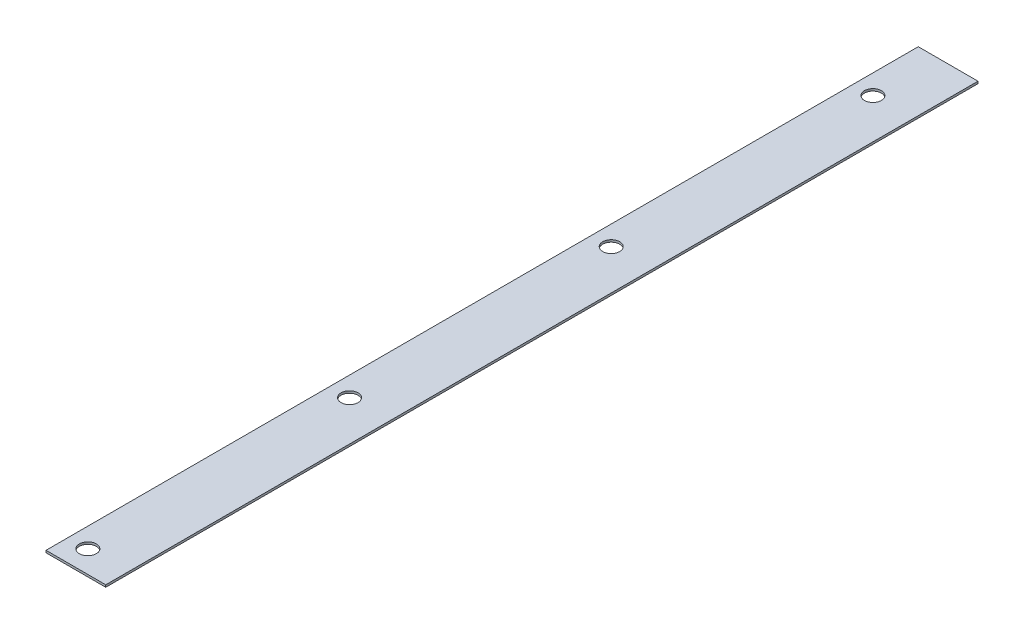
ISO-10303-21;
HEADER;
FILE_DESCRIPTION(('STEP AP214'),'2;1');
FILE_NAME('part.step','',(''),(''),'','','');
FILE_SCHEMA(('AUTOMOTIVE_DESIGN { 1 0 10303 214 1 1 1 1 }'));
ENDSEC;
DATA;
#1=APPLICATION_CONTEXT('core data for automotive mechanical design processes');
#2=APPLICATION_PROTOCOL_DEFINITION('international standard','automotive_design',2000,#1);
#3=PRODUCT_CONTEXT('',#1,'mechanical');
#4=PRODUCT('Part','Part','',(#3));
#5=PRODUCT_RELATED_PRODUCT_CATEGORY('part','',(#4));
#6=PRODUCT_DEFINITION_FORMATION('','',#4);
#7=PRODUCT_DEFINITION_CONTEXT('part definition',#1,'design');
#8=PRODUCT_DEFINITION('design','',#6,#7);
#9=PRODUCT_DEFINITION_SHAPE('','',#8);
#10=(LENGTH_UNIT() NAMED_UNIT(*) SI_UNIT(.MILLI.,.METRE.));
#11=(NAMED_UNIT(*) PLANE_ANGLE_UNIT() SI_UNIT($,.RADIAN.));
#12=(NAMED_UNIT(*) SI_UNIT($,.STERADIAN.) SOLID_ANGLE_UNIT());
#13=UNCERTAINTY_MEASURE_WITH_UNIT(LENGTH_MEASURE(1.E-05),#10,'distance_accuracy_value','');
#14=(GEOMETRIC_REPRESENTATION_CONTEXT(3) GLOBAL_UNCERTAINTY_ASSIGNED_CONTEXT((#13)) GLOBAL_UNIT_ASSIGNED_CONTEXT((#10,
#11,#12)) REPRESENTATION_CONTEXT('',''));
#15=CARTESIAN_POINT('',(0.,0.,0.));
#16=DIRECTION('',(0.,0.,1.));
#17=DIRECTION('',(1.,0.,0.));
#18=AXIS2_PLACEMENT_3D('',#15,#16,#17);
#19=CARTESIAN_POINT('',(0.,0.499999999999998,200.));
#20=DIRECTION('',(1.,0.,0.));
#21=DIRECTION('',(0.,0.,-1.));
#22=AXIS2_PLACEMENT_3D('',#19,#20,#21);
#23=PLANE('',#22);
#24=DIRECTION('',(0.,-1.,0.));
#25=VECTOR('',#24,1.);
#26=CARTESIAN_POINT('',(0.,0.499999999999998,0.));
#27=LINE('',#26,#25);
#28=CARTESIAN_POINT('',(0.,0.499999999999998,0.));
#29=VERTEX_POINT('',#28);
#30=CARTESIAN_POINT('',(0.,0.,0.));
#31=VERTEX_POINT('',#30);
#32=EDGE_CURVE('E96',#29,#31,#27,.T.);
#33=ORIENTED_EDGE('',*,*,#32,.T.);
#34=DIRECTION('',(0.,0.,-1.));
#35=VECTOR('',#34,1.);
#36=CARTESIAN_POINT('',(0.,0.,200.));
#37=LINE('',#36,#35);
#38=CARTESIAN_POINT('',(0.,0.,200.));
#39=VERTEX_POINT('',#38);
#40=EDGE_CURVE('E11',#39,#31,#37,.T.);
#41=ORIENTED_EDGE('',*,*,#40,.F.);
#42=DIRECTION('',(0.,-1.,0.));
#43=VECTOR('',#42,1.);
#44=CARTESIAN_POINT('',(0.,0.499999999999998,200.));
#45=LINE('',#44,#43);
#46=CARTESIAN_POINT('',(0.,0.499999999999998,200.));
#47=VERTEX_POINT('',#46);
#48=EDGE_CURVE('E84',#47,#39,#45,.T.);
#49=ORIENTED_EDGE('',*,*,#48,.F.);
#50=DIRECTION('',(0.,0.,-1.));
#51=VECTOR('',#50,1.);
#52=CARTESIAN_POINT('',(0.,0.499999999999998,200.));
#53=LINE('',#52,#51);
#54=EDGE_CURVE('E92',#47,#29,#53,.T.);
#55=ORIENTED_EDGE('',*,*,#54,.T.);
#56=EDGE_LOOP('',(#33,#41,#49,#55));
#57=FACE_BOUND('',#56,.T.);
#58=ADVANCED_FACE('F33',(#57),#23,.F.);
#59=CARTESIAN_POINT('',(0.,0.,200.));
#60=DIRECTION('',(0.,1.,0.));
#61=DIRECTION('',(0.,0.,1.));
#62=AXIS2_PLACEMENT_3D('',#59,#60,#61);
#63=PLANE('',#62);
#64=CARTESIAN_POINT('',(4.50000000000189,0.,194.9));
#65=DIRECTION('',(0.,1.,0.));
#66=DIRECTION('',(0.,0.,1.));
#67=AXIS2_PLACEMENT_3D('',#64,#65,#66);
#68=CIRCLE('',#67,1.95000000000001);
#69=CARTESIAN_POINT('',(4.50000000000189,0.,196.85));
#70=VERTEX_POINT('',#69);
#71=EDGE_CURVE('E127',#70,#70,#68,.F.);
#72=ORIENTED_EDGE('',*,*,#71,.F.);
#73=EDGE_LOOP('',(#72));
#74=FACE_BOUND('',#73,.T.);
#75=CARTESIAN_POINT('',(4.50000000000126,0.,134.9));
#76=DIRECTION('',(0.,1.,0.));
#77=DIRECTION('',(0.,0.,1.));
#78=AXIS2_PLACEMENT_3D('',#75,#76,#77);
#79=CIRCLE('',#78,1.95);
#80=CARTESIAN_POINT('',(4.50000000000126,0.,136.85));
#81=VERTEX_POINT('',#80);
#82=EDGE_CURVE('E121',#81,#81,#79,.F.);
#83=ORIENTED_EDGE('',*,*,#82,.F.);
#84=EDGE_LOOP('',(#83));
#85=FACE_BOUND('',#84,.T.);
#86=CARTESIAN_POINT('',(4.50000000000063,0.,74.9));
#87=DIRECTION('',(0.,1.,0.));
#88=DIRECTION('',(0.,0.,1.));
#89=AXIS2_PLACEMENT_3D('',#86,#87,#88);
#90=CIRCLE('',#89,1.94999999999999);
#91=CARTESIAN_POINT('',(4.50000000000063,0.,76.85));
#92=VERTEX_POINT('',#91);
#93=EDGE_CURVE('E115',#92,#92,#90,.F.);
#94=ORIENTED_EDGE('',*,*,#93,.F.);
#95=EDGE_LOOP('',(#94));
#96=FACE_BOUND('',#95,.T.);
#97=CARTESIAN_POINT('',(4.5,0.,14.9));
#98=DIRECTION('',(0.,1.,0.));
#99=DIRECTION('',(0.,0.,1.));
#100=AXIS2_PLACEMENT_3D('',#97,#98,#99);
#101=CIRCLE('',#100,1.95);
#102=CARTESIAN_POINT('',(4.5,0.,16.85));
#103=VERTEX_POINT('',#102);
#104=EDGE_CURVE('E99',#103,#103,#101,.F.);
#105=ORIENTED_EDGE('',*,*,#104,.F.);
#106=EDGE_LOOP('',(#105));
#107=FACE_BOUND('',#106,.T.);
#108=DIRECTION('',(1.,0.,0.));
#109=VECTOR('',#108,1.);
#110=CARTESIAN_POINT('',(0.,0.,0.));
#111=LINE('',#110,#109);
#112=CARTESIAN_POINT('',(13.7,0.,0.));
#113=VERTEX_POINT('',#112);
#114=EDGE_CURVE('E88',#31,#113,#111,.T.);
#115=ORIENTED_EDGE('',*,*,#114,.T.);
#116=DIRECTION('',(0.,0.,-1.));
#117=VECTOR('',#116,1.);
#118=CARTESIAN_POINT('',(13.7,0.,200.));
#119=LINE('',#118,#117);
#120=CARTESIAN_POINT('',(13.7,0.,200.));
#121=VERTEX_POINT('',#120);
#122=EDGE_CURVE('E41',#121,#113,#119,.T.);
#123=ORIENTED_EDGE('',*,*,#122,.F.);
#124=DIRECTION('',(1.,0.,0.));
#125=VECTOR('',#124,1.);
#126=CARTESIAN_POINT('',(0.,0.,200.));
#127=LINE('',#126,#125);
#128=EDGE_CURVE('E79',#39,#121,#127,.T.);
#129=ORIENTED_EDGE('',*,*,#128,.F.);
#130=ORIENTED_EDGE('',*,*,#40,.T.);
#131=EDGE_LOOP('',(#115,#123,#129,#130));
#132=FACE_BOUND('',#131,.T.);
#133=ADVANCED_FACE('F87',(#74,#85,#96,#107,#132),#63,.F.);
#134=CARTESIAN_POINT('',(13.7,0.499999999999998,200.));
#135=DIRECTION('',(-1.,0.,0.));
#136=DIRECTION('',(0.,0.,1.));
#137=AXIS2_PLACEMENT_3D('',#134,#135,#136);
#138=PLANE('',#137);
#139=DIRECTION('',(0.,1.,0.));
#140=VECTOR('',#139,1.);
#141=CARTESIAN_POINT('',(13.7,0.499999999999998,0.));
#142=LINE('',#141,#140);
#143=CARTESIAN_POINT('',(13.7,0.499999999999998,0.));
#144=VERTEX_POINT('',#143);
#145=EDGE_CURVE('E66',#113,#144,#142,.T.);
#146=ORIENTED_EDGE('',*,*,#145,.T.);
#147=DIRECTION('',(0.,0.,-1.));
#148=VECTOR('',#147,1.);
#149=CARTESIAN_POINT('',(13.7,0.499999999999998,200.));
#150=LINE('',#149,#148);
#151=CARTESIAN_POINT('',(13.7,0.499999999999998,200.));
#152=VERTEX_POINT('',#151);
#153=EDGE_CURVE('E89',#152,#144,#150,.T.);
#154=ORIENTED_EDGE('',*,*,#153,.F.);
#155=DIRECTION('',(0.,1.,0.));
#156=VECTOR('',#155,1.);
#157=CARTESIAN_POINT('',(13.7,0.499999999999998,200.));
#158=LINE('',#157,#156);
#159=EDGE_CURVE('E82',#121,#152,#158,.T.);
#160=ORIENTED_EDGE('',*,*,#159,.F.);
#161=ORIENTED_EDGE('',*,*,#122,.T.);
#162=EDGE_LOOP('',(#146,#154,#160,#161));
#163=FACE_BOUND('',#162,.T.);
#164=ADVANCED_FACE('F90',(#163),#138,.F.);
#165=CARTESIAN_POINT('',(13.7,0.499999999999998,200.));
#166=DIRECTION('',(0.,-1.,0.));
#167=DIRECTION('',(1.,0.,0.));
#168=AXIS2_PLACEMENT_3D('',#165,#166,#167);
#169=PLANE('',#168);
#170=CARTESIAN_POINT('',(4.50000000000189,0.499999999999998,194.9));
#171=DIRECTION('',(0.,1.,0.));
#172=DIRECTION('',(0.,0.,1.));
#173=AXIS2_PLACEMENT_3D('',#170,#171,#172);
#174=CIRCLE('',#173,1.95000000000001);
#175=CARTESIAN_POINT('',(4.50000000000189,0.499999999999998,196.85));
#176=VERTEX_POINT('',#175);
#177=EDGE_CURVE('E130',#176,#176,#174,.T.);
#178=ORIENTED_EDGE('',*,*,#177,.F.);
#179=EDGE_LOOP('',(#178));
#180=FACE_BOUND('',#179,.T.);
#181=CARTESIAN_POINT('',(4.50000000000126,0.499999999999998,134.9));
#182=DIRECTION('',(0.,1.,0.));
#183=DIRECTION('',(0.,0.,1.));
#184=AXIS2_PLACEMENT_3D('',#181,#182,#183);
#185=CIRCLE('',#184,1.95);
#186=CARTESIAN_POINT('',(4.50000000000126,0.499999999999998,136.85));
#187=VERTEX_POINT('',#186);
#188=EDGE_CURVE('E124',#187,#187,#185,.T.);
#189=ORIENTED_EDGE('',*,*,#188,.F.);
#190=EDGE_LOOP('',(#189));
#191=FACE_BOUND('',#190,.T.);
#192=CARTESIAN_POINT('',(4.50000000000063,0.499999999999998,74.9));
#193=DIRECTION('',(0.,1.,0.));
#194=DIRECTION('',(0.,0.,1.));
#195=AXIS2_PLACEMENT_3D('',#192,#193,#194);
#196=CIRCLE('',#195,1.94999999999999);
#197=CARTESIAN_POINT('',(4.50000000000063,0.499999999999998,76.85));
#198=VERTEX_POINT('',#197);
#199=EDGE_CURVE('E118',#198,#198,#196,.T.);
#200=ORIENTED_EDGE('',*,*,#199,.F.);
#201=EDGE_LOOP('',(#200));
#202=FACE_BOUND('',#201,.T.);
#203=CARTESIAN_POINT('',(4.5,0.499999999999998,14.9));
#204=DIRECTION('',(0.,1.,0.));
#205=DIRECTION('',(0.,0.,1.));
#206=AXIS2_PLACEMENT_3D('',#203,#204,#205);
#207=CIRCLE('',#206,1.95);
#208=CARTESIAN_POINT('',(4.5,0.499999999999998,16.85));
#209=VERTEX_POINT('',#208);
#210=EDGE_CURVE('E112',#209,#209,#207,.T.);
#211=ORIENTED_EDGE('',*,*,#210,.F.);
#212=EDGE_LOOP('',(#211));
#213=FACE_BOUND('',#212,.T.);
#214=DIRECTION('',(-1.,0.,0.));
#215=VECTOR('',#214,1.);
#216=CARTESIAN_POINT('',(13.7,0.499999999999998,0.));
#217=LINE('',#216,#215);
#218=EDGE_CURVE('E72',#144,#29,#217,.T.);
#219=ORIENTED_EDGE('',*,*,#218,.T.);
#220=ORIENTED_EDGE('',*,*,#54,.F.);
#221=DIRECTION('',(-1.,0.,0.));
#222=VECTOR('',#221,1.);
#223=CARTESIAN_POINT('',(13.7,0.499999999999998,200.));
#224=LINE('',#223,#222);
#225=EDGE_CURVE('E49',#152,#47,#224,.T.);
#226=ORIENTED_EDGE('',*,*,#225,.F.);
#227=ORIENTED_EDGE('',*,*,#153,.T.);
#228=EDGE_LOOP('',(#219,#220,#226,#227));
#229=FACE_BOUND('',#228,.T.);
#230=ADVANCED_FACE('F104',(#180,#191,#202,#213,#229),#169,.F.);
#231=CARTESIAN_POINT('',(0.,0.,200.));
#232=DIRECTION('',(0.,0.,1.));
#233=DIRECTION('',(1.,0.,0.));
#234=AXIS2_PLACEMENT_3D('',#231,#232,#233);
#235=PLANE('',#234);
#236=ORIENTED_EDGE('',*,*,#48,.T.);
#237=ORIENTED_EDGE('',*,*,#128,.T.);
#238=ORIENTED_EDGE('',*,*,#159,.T.);
#239=ORIENTED_EDGE('',*,*,#225,.T.);
#240=EDGE_LOOP('',(#236,#237,#238,#239));
#241=FACE_BOUND('',#240,.T.);
#242=ADVANCED_FACE('F80',(#241),#235,.T.);
#243=CARTESIAN_POINT('',(0.,0.,0.));
#244=DIRECTION('',(0.,0.,1.));
#245=DIRECTION('',(1.,0.,0.));
#246=AXIS2_PLACEMENT_3D('',#243,#244,#245);
#247=PLANE('',#246);
#248=ORIENTED_EDGE('',*,*,#32,.F.);
#249=ORIENTED_EDGE('',*,*,#218,.F.);
#250=ORIENTED_EDGE('',*,*,#145,.F.);
#251=ORIENTED_EDGE('',*,*,#114,.F.);
#252=EDGE_LOOP('',(#248,#249,#250,#251));
#253=FACE_BOUND('',#252,.T.);
#254=ADVANCED_FACE('F107',(#253),#247,.F.);
#255=CARTESIAN_POINT('',(4.5,-0.00100000000000002,14.9));
#256=DIRECTION('',(0.,1.,0.));
#257=DIRECTION('',(0.,0.,1.));
#258=AXIS2_PLACEMENT_3D('',#255,#256,#257);
#259=CYLINDRICAL_SURFACE('',#258,1.95);
#260=ORIENTED_EDGE('',*,*,#210,.T.);
#261=EDGE_LOOP('',(#260));
#262=FACE_BOUND('',#261,.T.);
#263=ORIENTED_EDGE('',*,*,#104,.T.);
#264=EDGE_LOOP('',(#263));
#265=FACE_BOUND('',#264,.T.);
#266=ADVANCED_FACE('F146',(#262,#265),#259,.F.);
#267=CARTESIAN_POINT('',(4.50000000000063,-0.00100000000000002,74.9));
#268=DIRECTION('',(0.,1.,0.));
#269=DIRECTION('',(0.,0.,1.));
#270=AXIS2_PLACEMENT_3D('',#267,#268,#269);
#271=CYLINDRICAL_SURFACE('',#270,1.94999999999999);
#272=ORIENTED_EDGE('',*,*,#199,.T.);
#273=EDGE_LOOP('',(#272));
#274=FACE_BOUND('',#273,.T.);
#275=ORIENTED_EDGE('',*,*,#93,.T.);
#276=EDGE_LOOP('',(#275));
#277=FACE_BOUND('',#276,.T.);
#278=ADVANCED_FACE('F149',(#274,#277),#271,.F.);
#279=CARTESIAN_POINT('',(4.50000000000126,-0.00100000000000002,134.9));
#280=DIRECTION('',(0.,1.,0.));
#281=DIRECTION('',(0.,0.,1.));
#282=AXIS2_PLACEMENT_3D('',#279,#280,#281);
#283=CYLINDRICAL_SURFACE('',#282,1.95);
#284=ORIENTED_EDGE('',*,*,#188,.T.);
#285=EDGE_LOOP('',(#284));
#286=FACE_BOUND('',#285,.T.);
#287=ORIENTED_EDGE('',*,*,#82,.T.);
#288=EDGE_LOOP('',(#287));
#289=FACE_BOUND('',#288,.T.);
#290=ADVANCED_FACE('F169',(#286,#289),#283,.F.);
#291=CARTESIAN_POINT('',(4.50000000000189,-0.00100000000000002,194.9));
#292=DIRECTION('',(0.,1.,0.));
#293=DIRECTION('',(0.,0.,1.));
#294=AXIS2_PLACEMENT_3D('',#291,#292,#293);
#295=CYLINDRICAL_SURFACE('',#294,1.95000000000001);
#296=ORIENTED_EDGE('',*,*,#177,.T.);
#297=EDGE_LOOP('',(#296));
#298=FACE_BOUND('',#297,.T.);
#299=ORIENTED_EDGE('',*,*,#71,.T.);
#300=EDGE_LOOP('',(#299));
#301=FACE_BOUND('',#300,.T.);
#302=ADVANCED_FACE('F134',(#298,#301),#295,.F.);
#303=CLOSED_SHELL('',(#58,#133,#164,#230,#242,#254,#266,#278,#290,#302));
#304=MANIFOLD_SOLID_BREP('B2',#303);
#305=ADVANCED_BREP_SHAPE_REPRESENTATION('',(#18,#304),#14);
#306=SHAPE_DEFINITION_REPRESENTATION(#9,#305);
ENDSEC;
END-ISO-10303-21;
